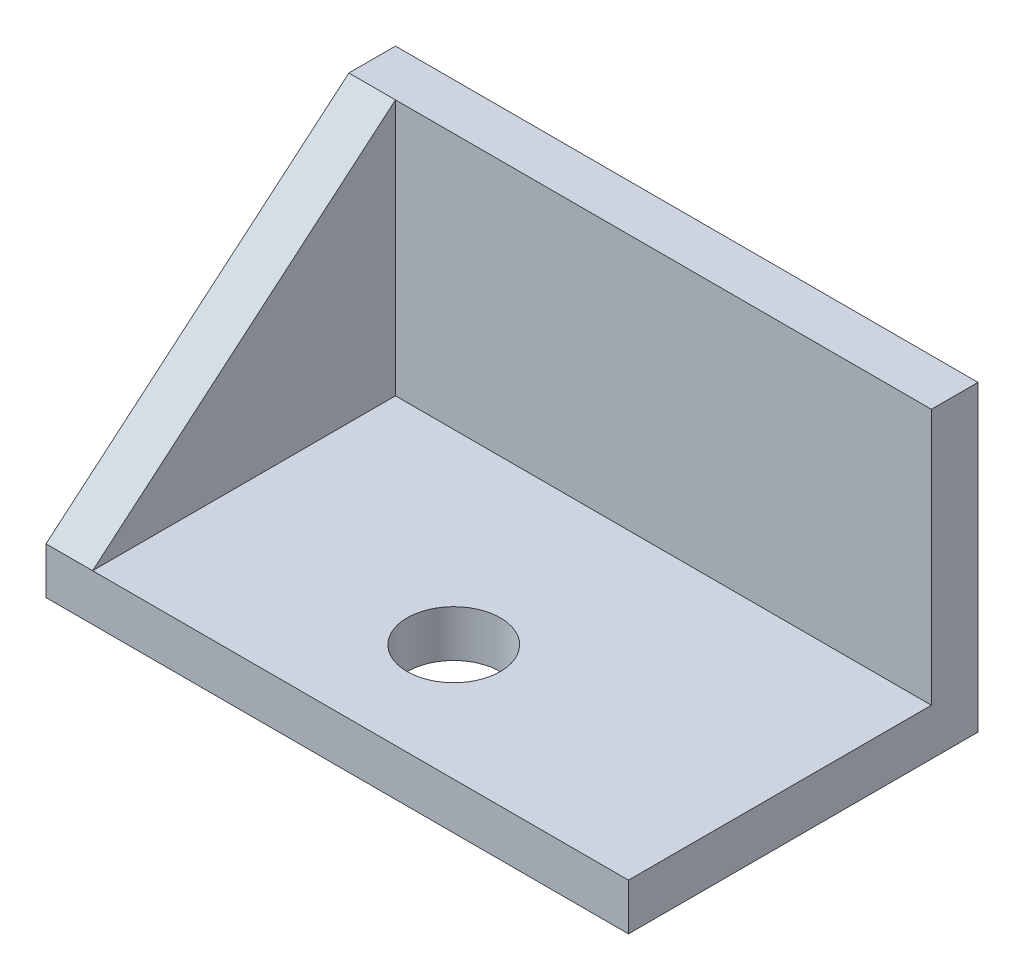
ISO-10303-21;
HEADER;
FILE_DESCRIPTION(('STEP AP214'),'2;1');
FILE_NAME('part.step','',(''),(''),'','','');
FILE_SCHEMA(('AUTOMOTIVE_DESIGN { 1 0 10303 214 1 1 1 1 }'));
ENDSEC;
DATA;
#1=APPLICATION_CONTEXT('core data for automotive mechanical design processes');
#2=APPLICATION_PROTOCOL_DEFINITION('international standard','automotive_design',2000,#1);
#3=PRODUCT_CONTEXT('',#1,'mechanical');
#4=PRODUCT('Part','Part','',(#3));
#5=PRODUCT_RELATED_PRODUCT_CATEGORY('part','',(#4));
#6=PRODUCT_DEFINITION_FORMATION('','',#4);
#7=PRODUCT_DEFINITION_CONTEXT('part definition',#1,'design');
#8=PRODUCT_DEFINITION('design','',#6,#7);
#9=PRODUCT_DEFINITION_SHAPE('','',#8);
#10=(LENGTH_UNIT() NAMED_UNIT(*) SI_UNIT(.MILLI.,.METRE.));
#11=(NAMED_UNIT(*) PLANE_ANGLE_UNIT() SI_UNIT($,.RADIAN.));
#12=(NAMED_UNIT(*) SI_UNIT($,.STERADIAN.) SOLID_ANGLE_UNIT());
#13=UNCERTAINTY_MEASURE_WITH_UNIT(LENGTH_MEASURE(1.E-05),#10,'distance_accuracy_value','');
#14=(GEOMETRIC_REPRESENTATION_CONTEXT(3) GLOBAL_UNCERTAINTY_ASSIGNED_CONTEXT((#13)) GLOBAL_UNIT_ASSIGNED_CONTEXT((#10,
#11,#12)) REPRESENTATION_CONTEXT('',''));
#15=CARTESIAN_POINT('',(0.,0.,0.));
#16=DIRECTION('',(0.,0.,1.));
#17=DIRECTION('',(1.,0.,0.));
#18=AXIS2_PLACEMENT_3D('',#15,#16,#17);
#19=CARTESIAN_POINT('',(125.,0.,0.));
#20=DIRECTION('',(0.,0.,1.));
#21=DIRECTION('',(1.,0.,0.));
#22=AXIS2_PLACEMENT_3D('',#19,#20,#21);
#23=PLANE('',#22);
#24=DIRECTION('',(0.,1.,0.));
#25=VECTOR('',#24,1.);
#26=CARTESIAN_POINT('',(0.,0.,0.));
#27=LINE('',#26,#25);
#28=CARTESIAN_POINT('',(0.,0.,0.));
#29=VERTEX_POINT('',#28);
#30=CARTESIAN_POINT('',(0.,65.,0.));
#31=VERTEX_POINT('',#30);
#32=EDGE_CURVE('E159',#29,#31,#27,.T.);
#33=ORIENTED_EDGE('',*,*,#32,.T.);
#34=DIRECTION('',(-1.,0.,0.));
#35=VECTOR('',#34,1.);
#36=CARTESIAN_POINT('',(125.,65.,0.));
#37=LINE('',#36,#35);
#38=CARTESIAN_POINT('',(125.,65.,0.));
#39=VERTEX_POINT('',#38);
#40=EDGE_CURVE('E52',#39,#31,#37,.T.);
#41=ORIENTED_EDGE('',*,*,#40,.F.);
#42=DIRECTION('',(0.,1.,0.));
#43=VECTOR('',#42,1.);
#44=CARTESIAN_POINT('',(125.,0.,0.));
#45=LINE('',#44,#43);
#46=CARTESIAN_POINT('',(125.,0.,0.));
#47=VERTEX_POINT('',#46);
#48=EDGE_CURVE('E179',#47,#39,#45,.T.);
#49=ORIENTED_EDGE('',*,*,#48,.F.);
#50=DIRECTION('',(-1.,0.,0.));
#51=VECTOR('',#50,1.);
#52=CARTESIAN_POINT('',(125.,0.,0.));
#53=LINE('',#52,#51);
#54=EDGE_CURVE('E161',#47,#29,#53,.T.);
#55=ORIENTED_EDGE('',*,*,#54,.T.);
#56=EDGE_LOOP('',(#33,#41,#49,#55));
#57=FACE_BOUND('',#56,.T.);
#58=ADVANCED_FACE('F44',(#57),#23,.F.);
#59=CARTESIAN_POINT('',(125.,65.,0.));
#60=DIRECTION('',(0.,-1.,0.));
#61=DIRECTION('',(0.,0.,-1.));
#62=AXIS2_PLACEMENT_3D('',#59,#60,#61);
#63=PLANE('',#62);
#64=DIRECTION('',(0.,0.,1.));
#65=VECTOR('',#64,1.);
#66=CARTESIAN_POINT('',(0.,65.,0.));
#67=LINE('',#66,#65);
#68=CARTESIAN_POINT('',(0.,65.,10.));
#69=VERTEX_POINT('',#68);
#70=EDGE_CURVE('E156',#31,#69,#67,.T.);
#71=ORIENTED_EDGE('',*,*,#70,.T.);
#72=DIRECTION('',(-1.,0.,0.));
#73=VECTOR('',#72,1.);
#74=CARTESIAN_POINT('',(125.,65.,10.));
#75=LINE('',#74,#73);
#76=CARTESIAN_POINT('',(9.99999999999999,65.,10.));
#77=VERTEX_POINT('',#76);
#78=EDGE_CURVE('E145',#77,#69,#75,.T.);
#79=ORIENTED_EDGE('',*,*,#78,.F.);
#80=CARTESIAN_POINT('',(125.,65.,10.));
#81=VERTEX_POINT('',#80);
#82=EDGE_CURVE('E148',#81,#77,#75,.T.);
#83=ORIENTED_EDGE('',*,*,#82,.F.);
#84=DIRECTION('',(0.,0.,1.));
#85=VECTOR('',#84,1.);
#86=CARTESIAN_POINT('',(125.,65.,0.));
#87=LINE('',#86,#85);
#88=EDGE_CURVE('E97',#39,#81,#87,.T.);
#89=ORIENTED_EDGE('',*,*,#88,.F.);
#90=ORIENTED_EDGE('',*,*,#40,.T.);
#91=EDGE_LOOP('',(#71,#79,#83,#89,#90));
#92=FACE_BOUND('',#91,.T.);
#93=ADVANCED_FACE('F154',(#92),#63,.F.);
#94=CARTESIAN_POINT('',(125.,9.99999999999999,75.));
#95=DIRECTION('',(0.,-0.763386285369115,-0.645942241466174));
#96=DIRECTION('',(0.,0.645942241466174,-0.763386285369114));
#97=AXIS2_PLACEMENT_3D('',#94,#95,#96);
#98=PLANE('',#97);
#99=DIRECTION('',(-1.,0.,0.));
#100=VECTOR('',#99,1.);
#101=CARTESIAN_POINT('',(125.,9.99999999999999,75.));
#102=LINE('',#101,#100);
#103=CARTESIAN_POINT('',(9.99999999999999,9.99999999999999,75.));
#104=VERTEX_POINT('',#103);
#105=CARTESIAN_POINT('',(0.,9.99999999999999,75.));
#106=VERTEX_POINT('',#105);
#107=EDGE_CURVE('E128',#104,#106,#102,.T.);
#108=ORIENTED_EDGE('',*,*,#107,.F.);
#109=DIRECTION('',(0.,0.645942241466174,-0.763386285369114));
#110=VECTOR('',#109,1.);
#111=CARTESIAN_POINT('',(9.99999999999999,9.99999999999999,75.));
#112=LINE('',#111,#110);
#113=EDGE_CURVE('E11',#104,#77,#112,.T.);
#114=ORIENTED_EDGE('',*,*,#113,.T.);
#115=ORIENTED_EDGE('',*,*,#78,.T.);
#116=DIRECTION('',(0.,-0.645942241466174,0.763386285369114));
#117=VECTOR('',#116,1.);
#118=CARTESIAN_POINT('',(0.,9.99999999999999,75.));
#119=LINE('',#118,#117);
#120=EDGE_CURVE('E135',#69,#106,#119,.T.);
#121=ORIENTED_EDGE('',*,*,#120,.T.);
#122=EDGE_LOOP('',(#108,#114,#115,#121));
#123=FACE_BOUND('',#122,.T.);
#124=ADVANCED_FACE('F134',(#123),#98,.F.);
#125=CARTESIAN_POINT('',(125.,0.,75.));
#126=DIRECTION('',(0.,0.,-1.));
#127=DIRECTION('',(-1.,0.,0.));
#128=AXIS2_PLACEMENT_3D('',#125,#126,#127);
#129=PLANE('',#128);
#130=DIRECTION('',(0.,-1.,0.));
#131=VECTOR('',#130,1.);
#132=CARTESIAN_POINT('',(0.,0.,75.));
#133=LINE('',#132,#131);
#134=CARTESIAN_POINT('',(0.,0.,75.));
#135=VERTEX_POINT('',#134);
#136=EDGE_CURVE('E173',#106,#135,#133,.T.);
#137=ORIENTED_EDGE('',*,*,#136,.T.);
#138=DIRECTION('',(-1.,0.,0.));
#139=VECTOR('',#138,1.);
#140=CARTESIAN_POINT('',(125.,0.,75.));
#141=LINE('',#140,#139);
#142=CARTESIAN_POINT('',(125.,0.,75.));
#143=VERTEX_POINT('',#142);
#144=EDGE_CURVE('E140',#143,#135,#141,.T.);
#145=ORIENTED_EDGE('',*,*,#144,.F.);
#146=DIRECTION('',(0.,-1.,0.));
#147=VECTOR('',#146,1.);
#148=CARTESIAN_POINT('',(125.,0.,75.));
#149=LINE('',#148,#147);
#150=CARTESIAN_POINT('',(125.,9.99999999999999,75.));
#151=VERTEX_POINT('',#150);
#152=EDGE_CURVE('E142',#151,#143,#149,.T.);
#153=ORIENTED_EDGE('',*,*,#152,.F.);
#154=EDGE_CURVE('E124',#151,#104,#102,.T.);
#155=ORIENTED_EDGE('',*,*,#154,.T.);
#156=ORIENTED_EDGE('',*,*,#107,.T.);
#157=EDGE_LOOP('',(#137,#145,#153,#155,#156));
#158=FACE_BOUND('',#157,.T.);
#159=ADVANCED_FACE('F138',(#158),#129,.F.);
#160=CARTESIAN_POINT('',(125.,0.,0.));
#161=DIRECTION('',(0.,1.,0.));
#162=DIRECTION('',(0.,0.,1.));
#163=AXIS2_PLACEMENT_3D('',#160,#161,#162);
#164=PLANE('',#163);
#165=CARTESIAN_POINT('',(62.5,0.,50.));
#166=DIRECTION('',(0.,1.,0.));
#167=DIRECTION('',(0.,0.,1.));
#168=AXIS2_PLACEMENT_3D('',#165,#166,#167);
#169=CIRCLE('',#168,10.);
#170=CARTESIAN_POINT('',(62.5,0.,60.));
#171=VERTEX_POINT('',#170);
#172=EDGE_CURVE('E194',#171,#171,#169,.T.);
#173=ORIENTED_EDGE('',*,*,#172,.T.);
#174=EDGE_LOOP('',(#173));
#175=FACE_BOUND('',#174,.T.);
#176=DIRECTION('',(0.,0.,-1.));
#177=VECTOR('',#176,1.);
#178=CARTESIAN_POINT('',(0.,0.,0.));
#179=LINE('',#178,#177);
#180=EDGE_CURVE('E95',#135,#29,#179,.T.);
#181=ORIENTED_EDGE('',*,*,#180,.T.);
#182=ORIENTED_EDGE('',*,*,#54,.F.);
#183=DIRECTION('',(0.,0.,-1.));
#184=VECTOR('',#183,1.);
#185=CARTESIAN_POINT('',(125.,0.,0.));
#186=LINE('',#185,#184);
#187=EDGE_CURVE('E66',#143,#47,#186,.T.);
#188=ORIENTED_EDGE('',*,*,#187,.F.);
#189=ORIENTED_EDGE('',*,*,#144,.T.);
#190=EDGE_LOOP('',(#181,#182,#188,#189));
#191=FACE_BOUND('',#190,.T.);
#192=ADVANCED_FACE('F232',(#175,#191),#164,.F.);
#193=CARTESIAN_POINT('',(125.,0.,0.));
#194=DIRECTION('',(1.,0.,0.));
#195=DIRECTION('',(0.,0.,-1.));
#196=AXIS2_PLACEMENT_3D('',#193,#194,#195);
#197=PLANE('',#196);
#198=DIRECTION('',(0.,0.,-1.));
#199=VECTOR('',#198,1.);
#200=CARTESIAN_POINT('',(125.,9.99999999999999,75.));
#201=LINE('',#200,#199);
#202=CARTESIAN_POINT('',(125.,9.99999999999999,10.));
#203=VERTEX_POINT('',#202);
#204=EDGE_CURVE('E187',#151,#203,#201,.T.);
#205=ORIENTED_EDGE('',*,*,#204,.F.);
#206=ORIENTED_EDGE('',*,*,#152,.T.);
#207=ORIENTED_EDGE('',*,*,#187,.T.);
#208=ORIENTED_EDGE('',*,*,#48,.T.);
#209=ORIENTED_EDGE('',*,*,#88,.T.);
#210=DIRECTION('',(0.,1.,0.));
#211=VECTOR('',#210,1.);
#212=CARTESIAN_POINT('',(125.,9.99999999999999,10.));
#213=LINE('',#212,#211);
#214=EDGE_CURVE('E130',#203,#81,#213,.T.);
#215=ORIENTED_EDGE('',*,*,#214,.F.);
#216=EDGE_LOOP('',(#205,#206,#207,#208,#209,#215));
#217=FACE_BOUND('',#216,.T.);
#218=ADVANCED_FACE('F234',(#217),#197,.T.);
#219=CARTESIAN_POINT('',(0.,0.,0.));
#220=DIRECTION('',(1.,0.,0.));
#221=DIRECTION('',(0.,0.,-1.));
#222=AXIS2_PLACEMENT_3D('',#219,#220,#221);
#223=PLANE('',#222);
#224=ORIENTED_EDGE('',*,*,#32,.F.);
#225=ORIENTED_EDGE('',*,*,#180,.F.);
#226=ORIENTED_EDGE('',*,*,#136,.F.);
#227=ORIENTED_EDGE('',*,*,#120,.F.);
#228=ORIENTED_EDGE('',*,*,#70,.F.);
#229=EDGE_LOOP('',(#224,#225,#226,#227,#228));
#230=FACE_BOUND('',#229,.T.);
#231=ADVANCED_FACE('F233',(#230),#223,.F.);
#232=CARTESIAN_POINT('',(9.99999999999999,0.,0.));
#233=DIRECTION('',(-1.,0.,0.));
#234=DIRECTION('',(0.,0.,1.));
#235=AXIS2_PLACEMENT_3D('',#232,#233,#234);
#236=PLANE('',#235);
#237=DIRECTION('',(0.,0.,-1.));
#238=VECTOR('',#237,1.);
#239=CARTESIAN_POINT('',(9.99999999999999,9.99999999999999,75.));
#240=LINE('',#239,#238);
#241=CARTESIAN_POINT('',(9.99999999999999,9.99999999999999,10.));
#242=VERTEX_POINT('',#241);
#243=EDGE_CURVE('E113',#104,#242,#240,.T.);
#244=ORIENTED_EDGE('',*,*,#243,.T.);
#245=DIRECTION('',(0.,1.,0.));
#246=VECTOR('',#245,1.);
#247=CARTESIAN_POINT('',(9.99999999999999,9.99999999999999,10.));
#248=LINE('',#247,#246);
#249=EDGE_CURVE('E58',#242,#77,#248,.T.);
#250=ORIENTED_EDGE('',*,*,#249,.T.);
#251=ORIENTED_EDGE('',*,*,#113,.F.);
#252=EDGE_LOOP('',(#244,#250,#251));
#253=FACE_BOUND('',#252,.T.);
#254=ADVANCED_FACE('F111',(#253),#236,.F.);
#255=CARTESIAN_POINT('',(9.99999999999999,9.99999999999999,10.));
#256=DIRECTION('',(0.,0.,-1.));
#257=DIRECTION('',(-1.,0.,0.));
#258=AXIS2_PLACEMENT_3D('',#255,#256,#257);
#259=PLANE('',#258);
#260=ORIENTED_EDGE('',*,*,#214,.T.);
#261=ORIENTED_EDGE('',*,*,#82,.T.);
#262=ORIENTED_EDGE('',*,*,#249,.F.);
#263=DIRECTION('',(1.,0.,0.));
#264=VECTOR('',#263,1.);
#265=CARTESIAN_POINT('',(9.99999999999999,9.99999999999999,10.));
#266=LINE('',#265,#264);
#267=EDGE_CURVE('E123',#242,#203,#266,.T.);
#268=ORIENTED_EDGE('',*,*,#267,.T.);
#269=EDGE_LOOP('',(#260,#261,#262,#268));
#270=FACE_BOUND('',#269,.T.);
#271=ADVANCED_FACE('F210',(#270),#259,.F.);
#272=CARTESIAN_POINT('',(9.99999999999999,9.99999999999999,75.));
#273=DIRECTION('',(0.,-1.,0.));
#274=DIRECTION('',(0.,0.,-1.));
#275=AXIS2_PLACEMENT_3D('',#272,#273,#274);
#276=PLANE('',#275);
#277=CARTESIAN_POINT('',(62.5,9.99999999999999,50.));
#278=DIRECTION('',(0.,1.,0.));
#279=DIRECTION('',(0.,0.,1.));
#280=AXIS2_PLACEMENT_3D('',#277,#278,#279);
#281=CIRCLE('',#280,10.);
#282=CARTESIAN_POINT('',(62.5,9.99999999999999,60.));
#283=VERTEX_POINT('',#282);
#284=EDGE_CURVE('E200',#283,#283,#281,.T.);
#285=ORIENTED_EDGE('',*,*,#284,.F.);
#286=EDGE_LOOP('',(#285));
#287=FACE_BOUND('',#286,.T.);
#288=ORIENTED_EDGE('',*,*,#204,.T.);
#289=ORIENTED_EDGE('',*,*,#267,.F.);
#290=ORIENTED_EDGE('',*,*,#243,.F.);
#291=ORIENTED_EDGE('',*,*,#154,.F.);
#292=EDGE_LOOP('',(#288,#289,#290,#291));
#293=FACE_BOUND('',#292,.T.);
#294=ADVANCED_FACE('F122',(#287,#293),#276,.F.);
#295=CARTESIAN_POINT('',(62.5,9.99999999999999,50.));
#296=DIRECTION('',(0.,1.,0.));
#297=DIRECTION('',(0.,0.,1.));
#298=AXIS2_PLACEMENT_3D('',#295,#296,#297);
#299=CYLINDRICAL_SURFACE('',#298,10.);
#300=ORIENTED_EDGE('',*,*,#172,.F.);
#301=EDGE_LOOP('',(#300));
#302=FACE_BOUND('',#301,.T.);
#303=ORIENTED_EDGE('',*,*,#284,.T.);
#304=EDGE_LOOP('',(#303));
#305=FACE_BOUND('',#304,.T.);
#306=ADVANCED_FACE('F204',(#302,#305),#299,.F.);
#307=CLOSED_SHELL('',(#58,#93,#124,#159,#192,#218,#231,#254,#271,#294,#306));
#308=MANIFOLD_SOLID_BREP('B2',#307);
#309=ADVANCED_BREP_SHAPE_REPRESENTATION('',(#18,#308),#14);
#310=SHAPE_DEFINITION_REPRESENTATION(#9,#309);
ENDSEC;
END-ISO-10303-21;
